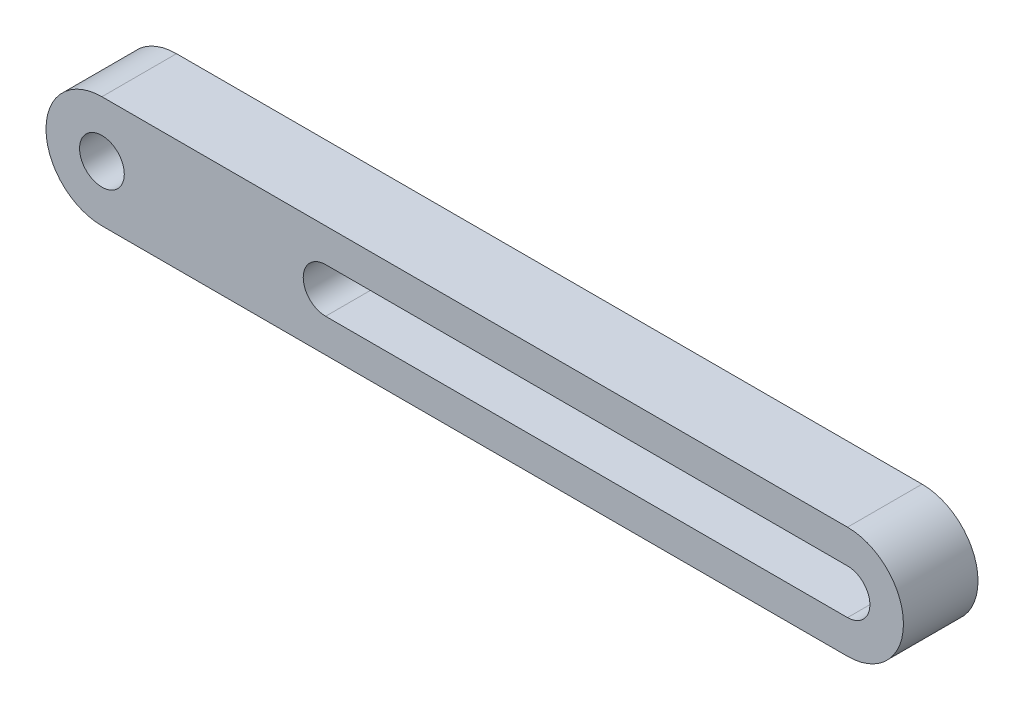
ISO-10303-21;
HEADER;
FILE_DESCRIPTION(('STEP AP214'),'2;1');
FILE_NAME('part.step','',(''),(''),'','','');
FILE_SCHEMA(('AUTOMOTIVE_DESIGN { 1 0 10303 214 1 1 1 1 }'));
ENDSEC;
DATA;
#1=APPLICATION_CONTEXT('core data for automotive mechanical design processes');
#2=APPLICATION_PROTOCOL_DEFINITION('international standard','automotive_design',2000,#1);
#3=PRODUCT_CONTEXT('',#1,'mechanical');
#4=PRODUCT('Part','Part','',(#3));
#5=PRODUCT_RELATED_PRODUCT_CATEGORY('part','',(#4));
#6=PRODUCT_DEFINITION_FORMATION('','',#4);
#7=PRODUCT_DEFINITION_CONTEXT('part definition',#1,'design');
#8=PRODUCT_DEFINITION('design','',#6,#7);
#9=PRODUCT_DEFINITION_SHAPE('','',#8);
#10=(LENGTH_UNIT() NAMED_UNIT(*) SI_UNIT(.MILLI.,.METRE.));
#11=(NAMED_UNIT(*) PLANE_ANGLE_UNIT() SI_UNIT($,.RADIAN.));
#12=(NAMED_UNIT(*) SI_UNIT($,.STERADIAN.) SOLID_ANGLE_UNIT());
#13=UNCERTAINTY_MEASURE_WITH_UNIT(LENGTH_MEASURE(1.E-05),#10,'distance_accuracy_value','');
#14=(GEOMETRIC_REPRESENTATION_CONTEXT(3) GLOBAL_UNCERTAINTY_ASSIGNED_CONTEXT((#13)) GLOBAL_UNIT_ASSIGNED_CONTEXT((#10,
#11,#12)) REPRESENTATION_CONTEXT('',''));
#15=CARTESIAN_POINT('',(0.,0.,0.));
#16=DIRECTION('',(0.,0.,1.));
#17=DIRECTION('',(1.,0.,0.));
#18=AXIS2_PLACEMENT_3D('',#15,#16,#17);
#19=CARTESIAN_POINT('',(0.,0.,5.));
#20=DIRECTION('',(0.,0.,1.));
#21=DIRECTION('',(1.,0.,0.));
#22=AXIS2_PLACEMENT_3D('',#19,#20,#21);
#23=PLANE('',#22);
#24=CARTESIAN_POINT('',(0.,0.,5.));
#25=DIRECTION('',(0.,0.,1.));
#26=DIRECTION('',(1.,0.,0.));
#27=AXIS2_PLACEMENT_3D('',#24,#25,#26);
#28=CIRCLE('',#27,1.5);
#29=CARTESIAN_POINT('',(1.5,0.,5.));
#30=VERTEX_POINT('',#29);
#31=EDGE_CURVE('E134',#30,#30,#28,.T.);
#32=ORIENTED_EDGE('',*,*,#31,.F.);
#33=EDGE_LOOP('',(#32));
#34=FACE_BOUND('',#33,.T.);
#35=CARTESIAN_POINT('',(0.,0.,5.));
#36=DIRECTION('',(0.,0.,1.));
#37=DIRECTION('',(1.,0.,0.));
#38=AXIS2_PLACEMENT_3D('',#35,#36,#37);
#39=CIRCLE('',#38,3.75);
#40=CARTESIAN_POINT('',(0.,3.75,5.));
#41=VERTEX_POINT('',#40);
#42=CARTESIAN_POINT('',(0.,-3.75,5.));
#43=VERTEX_POINT('',#42);
#44=EDGE_CURVE('E140',#41,#43,#39,.T.);
#45=ORIENTED_EDGE('',*,*,#44,.T.);
#46=DIRECTION('',(1.,0.,0.));
#47=VECTOR('',#46,1.);
#48=CARTESIAN_POINT('',(0.,-3.75,5.));
#49=LINE('',#48,#47);
#50=CARTESIAN_POINT('',(50.,-3.75,5.));
#51=VERTEX_POINT('',#50);
#52=EDGE_CURVE('E143',#43,#51,#49,.T.);
#53=ORIENTED_EDGE('',*,*,#52,.T.);
#54=CARTESIAN_POINT('',(50.,0.,5.));
#55=DIRECTION('',(0.,0.,1.));
#56=DIRECTION('',(1.,0.,0.));
#57=AXIS2_PLACEMENT_3D('',#54,#55,#56);
#58=CIRCLE('',#57,3.75);
#59=CARTESIAN_POINT('',(50.,3.75,5.));
#60=VERTEX_POINT('',#59);
#61=EDGE_CURVE('E146',#51,#60,#58,.T.);
#62=ORIENTED_EDGE('',*,*,#61,.T.);
#63=DIRECTION('',(-1.,0.,0.));
#64=VECTOR('',#63,1.);
#65=CARTESIAN_POINT('',(0.,3.75,5.));
#66=LINE('',#65,#64);
#67=EDGE_CURVE('E148',#60,#41,#66,.T.);
#68=ORIENTED_EDGE('',*,*,#67,.T.);
#69=EDGE_LOOP('',(#45,#53,#62,#68));
#70=FACE_BOUND('',#69,.T.);
#71=DIRECTION('',(1.,0.,0.));
#72=VECTOR('',#71,1.);
#73=CARTESIAN_POINT('',(15.,-1.5,5.));
#74=LINE('',#73,#72);
#75=CARTESIAN_POINT('',(15.,-1.5,5.));
#76=VERTEX_POINT('',#75);
#77=CARTESIAN_POINT('',(50.,-1.5,5.));
#78=VERTEX_POINT('',#77);
#79=EDGE_CURVE('E106',#76,#78,#74,.T.);
#80=ORIENTED_EDGE('',*,*,#79,.F.);
#81=CARTESIAN_POINT('',(15.,0.,5.));
#82=DIRECTION('',(0.,0.,1.));
#83=DIRECTION('',(1.,0.,0.));
#84=AXIS2_PLACEMENT_3D('',#81,#82,#83);
#85=CIRCLE('',#84,1.5);
#86=CARTESIAN_POINT('',(15.,1.5,5.));
#87=VERTEX_POINT('',#86);
#88=EDGE_CURVE('E98',#87,#76,#85,.T.);
#89=ORIENTED_EDGE('',*,*,#88,.F.);
#90=DIRECTION('',(-1.,0.,0.));
#91=VECTOR('',#90,1.);
#92=CARTESIAN_POINT('',(15.,1.5,5.));
#93=LINE('',#92,#91);
#94=CARTESIAN_POINT('',(50.,1.5,5.));
#95=VERTEX_POINT('',#94);
#96=EDGE_CURVE('E120',#95,#87,#93,.T.);
#97=ORIENTED_EDGE('',*,*,#96,.F.);
#98=CARTESIAN_POINT('',(50.,0.,5.));
#99=DIRECTION('',(0.,0.,1.));
#100=DIRECTION('',(1.,0.,0.));
#101=AXIS2_PLACEMENT_3D('',#98,#99,#100);
#102=CIRCLE('',#101,1.5);
#103=EDGE_CURVE('E118',#78,#95,#102,.T.);
#104=ORIENTED_EDGE('',*,*,#103,.F.);
#105=EDGE_LOOP('',(#80,#89,#97,#104));
#106=FACE_BOUND('',#105,.T.);
#107=ADVANCED_FACE('F33',(#34,#70,#106),#23,.T.);
#108=CARTESIAN_POINT('',(0.,0.,0.));
#109=DIRECTION('',(0.,0.,1.));
#110=DIRECTION('',(1.,0.,0.));
#111=AXIS2_PLACEMENT_3D('',#108,#109,#110);
#112=PLANE('',#111);
#113=CARTESIAN_POINT('',(0.,0.,0.));
#114=DIRECTION('',(0.,0.,1.));
#115=DIRECTION('',(1.,0.,0.));
#116=AXIS2_PLACEMENT_3D('',#113,#114,#115);
#117=CIRCLE('',#116,1.5);
#118=CARTESIAN_POINT('',(1.5,0.,0.));
#119=VERTEX_POINT('',#118);
#120=EDGE_CURVE('E114',#119,#119,#117,.T.);
#121=ORIENTED_EDGE('',*,*,#120,.T.);
#122=EDGE_LOOP('',(#121));
#123=FACE_BOUND('',#122,.T.);
#124=CARTESIAN_POINT('',(0.,0.,0.));
#125=DIRECTION('',(0.,0.,1.));
#126=DIRECTION('',(1.,0.,0.));
#127=AXIS2_PLACEMENT_3D('',#124,#125,#126);
#128=CIRCLE('',#127,3.75);
#129=CARTESIAN_POINT('',(0.,3.75,0.));
#130=VERTEX_POINT('',#129);
#131=CARTESIAN_POINT('',(0.,-3.75,0.));
#132=VERTEX_POINT('',#131);
#133=EDGE_CURVE('E137',#130,#132,#128,.T.);
#134=ORIENTED_EDGE('',*,*,#133,.F.);
#135=DIRECTION('',(-1.,0.,0.));
#136=VECTOR('',#135,1.);
#137=CARTESIAN_POINT('',(0.,3.75,0.));
#138=LINE('',#137,#136);
#139=CARTESIAN_POINT('',(50.,3.75,0.));
#140=VERTEX_POINT('',#139);
#141=EDGE_CURVE('E144',#140,#130,#138,.T.);
#142=ORIENTED_EDGE('',*,*,#141,.F.);
#143=CARTESIAN_POINT('',(50.,0.,0.));
#144=DIRECTION('',(0.,0.,1.));
#145=DIRECTION('',(1.,0.,0.));
#146=AXIS2_PLACEMENT_3D('',#143,#144,#145);
#147=CIRCLE('',#146,3.75);
#148=CARTESIAN_POINT('',(50.,-3.75,0.));
#149=VERTEX_POINT('',#148);
#150=EDGE_CURVE('E155',#149,#140,#147,.T.);
#151=ORIENTED_EDGE('',*,*,#150,.F.);
#152=DIRECTION('',(1.,0.,0.));
#153=VECTOR('',#152,1.);
#154=CARTESIAN_POINT('',(0.,-3.75,0.));
#155=LINE('',#154,#153);
#156=EDGE_CURVE('E153',#132,#149,#155,.T.);
#157=ORIENTED_EDGE('',*,*,#156,.F.);
#158=EDGE_LOOP('',(#134,#142,#151,#157));
#159=FACE_BOUND('',#158,.T.);
#160=CARTESIAN_POINT('',(15.,0.,0.));
#161=DIRECTION('',(0.,0.,1.));
#162=DIRECTION('',(1.,0.,0.));
#163=AXIS2_PLACEMENT_3D('',#160,#161,#162);
#164=CIRCLE('',#163,1.5);
#165=CARTESIAN_POINT('',(15.,1.5,0.));
#166=VERTEX_POINT('',#165);
#167=CARTESIAN_POINT('',(15.,-1.5,0.));
#168=VERTEX_POINT('',#167);
#169=EDGE_CURVE('E56',#166,#168,#164,.T.);
#170=ORIENTED_EDGE('',*,*,#169,.T.);
#171=DIRECTION('',(1.,0.,0.));
#172=VECTOR('',#171,1.);
#173=CARTESIAN_POINT('',(15.,-1.5,0.));
#174=LINE('',#173,#172);
#175=CARTESIAN_POINT('',(50.,-1.5,0.));
#176=VERTEX_POINT('',#175);
#177=EDGE_CURVE('E113',#168,#176,#174,.T.);
#178=ORIENTED_EDGE('',*,*,#177,.T.);
#179=CARTESIAN_POINT('',(50.,0.,0.));
#180=DIRECTION('',(0.,0.,1.));
#181=DIRECTION('',(1.,0.,0.));
#182=AXIS2_PLACEMENT_3D('',#179,#180,#181);
#183=CIRCLE('',#182,1.5);
#184=CARTESIAN_POINT('',(50.,1.5,0.));
#185=VERTEX_POINT('',#184);
#186=EDGE_CURVE('E126',#176,#185,#183,.T.);
#187=ORIENTED_EDGE('',*,*,#186,.T.);
#188=DIRECTION('',(-1.,0.,0.));
#189=VECTOR('',#188,1.);
#190=CARTESIAN_POINT('',(15.,1.5,0.));
#191=LINE('',#190,#189);
#192=EDGE_CURVE('E107',#185,#166,#191,.T.);
#193=ORIENTED_EDGE('',*,*,#192,.T.);
#194=EDGE_LOOP('',(#170,#178,#187,#193));
#195=FACE_BOUND('',#194,.T.);
#196=ADVANCED_FACE('F173',(#123,#159,#195),#112,.F.);
#197=CARTESIAN_POINT('',(0.,0.,5.));
#198=DIRECTION('',(0.,0.,-1.));
#199=DIRECTION('',(-1.,0.,0.));
#200=AXIS2_PLACEMENT_3D('',#197,#198,#199);
#201=CYLINDRICAL_SURFACE('',#200,3.75);
#202=ORIENTED_EDGE('',*,*,#133,.T.);
#203=DIRECTION('',(0.,0.,-1.));
#204=VECTOR('',#203,1.);
#205=CARTESIAN_POINT('',(0.,-3.75,5.));
#206=LINE('',#205,#204);
#207=EDGE_CURVE('E11',#43,#132,#206,.T.);
#208=ORIENTED_EDGE('',*,*,#207,.F.);
#209=ORIENTED_EDGE('',*,*,#44,.F.);
#210=DIRECTION('',(0.,0.,-1.));
#211=VECTOR('',#210,1.);
#212=CARTESIAN_POINT('',(0.,3.75,5.));
#213=LINE('',#212,#211);
#214=EDGE_CURVE('E150',#41,#130,#213,.T.);
#215=ORIENTED_EDGE('',*,*,#214,.T.);
#216=EDGE_LOOP('',(#202,#208,#209,#215));
#217=FACE_BOUND('',#216,.T.);
#218=ADVANCED_FACE('F35',(#217),#201,.T.);
#219=CARTESIAN_POINT('',(0.,-3.75,5.));
#220=DIRECTION('',(0.,1.,0.));
#221=DIRECTION('',(0.,0.,1.));
#222=AXIS2_PLACEMENT_3D('',#219,#220,#221);
#223=PLANE('',#222);
#224=ORIENTED_EDGE('',*,*,#156,.T.);
#225=DIRECTION('',(0.,0.,-1.));
#226=VECTOR('',#225,1.);
#227=CARTESIAN_POINT('',(50.,-3.75,5.));
#228=LINE('',#227,#226);
#229=EDGE_CURVE('E41',#51,#149,#228,.T.);
#230=ORIENTED_EDGE('',*,*,#229,.F.);
#231=ORIENTED_EDGE('',*,*,#52,.F.);
#232=ORIENTED_EDGE('',*,*,#207,.T.);
#233=EDGE_LOOP('',(#224,#230,#231,#232));
#234=FACE_BOUND('',#233,.T.);
#235=ADVANCED_FACE('F183',(#234),#223,.F.);
#236=CARTESIAN_POINT('',(50.,0.,5.));
#237=DIRECTION('',(0.,0.,-1.));
#238=DIRECTION('',(-1.,0.,0.));
#239=AXIS2_PLACEMENT_3D('',#236,#237,#238);
#240=CYLINDRICAL_SURFACE('',#239,3.75);
#241=ORIENTED_EDGE('',*,*,#150,.T.);
#242=DIRECTION('',(0.,0.,-1.));
#243=VECTOR('',#242,1.);
#244=CARTESIAN_POINT('',(50.,3.75,5.));
#245=LINE('',#244,#243);
#246=EDGE_CURVE('E160',#60,#140,#245,.T.);
#247=ORIENTED_EDGE('',*,*,#246,.F.);
#248=ORIENTED_EDGE('',*,*,#61,.F.);
#249=ORIENTED_EDGE('',*,*,#229,.T.);
#250=EDGE_LOOP('',(#241,#247,#248,#249));
#251=FACE_BOUND('',#250,.T.);
#252=ADVANCED_FACE('F167',(#251),#240,.T.);
#253=CARTESIAN_POINT('',(0.,3.75,5.));
#254=DIRECTION('',(0.,-1.,0.));
#255=DIRECTION('',(0.,0.,-1.));
#256=AXIS2_PLACEMENT_3D('',#253,#254,#255);
#257=PLANE('',#256);
#258=ORIENTED_EDGE('',*,*,#141,.T.);
#259=ORIENTED_EDGE('',*,*,#214,.F.);
#260=ORIENTED_EDGE('',*,*,#67,.F.);
#261=ORIENTED_EDGE('',*,*,#246,.T.);
#262=EDGE_LOOP('',(#258,#259,#260,#261));
#263=FACE_BOUND('',#262,.T.);
#264=ADVANCED_FACE('F177',(#263),#257,.F.);
#265=CARTESIAN_POINT('',(0.,0.,5.));
#266=DIRECTION('',(0.,0.,-1.));
#267=DIRECTION('',(-1.,0.,0.));
#268=AXIS2_PLACEMENT_3D('',#265,#266,#267);
#269=CYLINDRICAL_SURFACE('',#268,1.5);
#270=ORIENTED_EDGE('',*,*,#31,.T.);
#271=EDGE_LOOP('',(#270));
#272=FACE_BOUND('',#271,.T.);
#273=ORIENTED_EDGE('',*,*,#120,.F.);
#274=EDGE_LOOP('',(#273));
#275=FACE_BOUND('',#274,.T.);
#276=ADVANCED_FACE('F200',(#272,#275),#269,.F.);
#277=CARTESIAN_POINT('',(15.,0.,5.));
#278=DIRECTION('',(0.,0.,-1.));
#279=DIRECTION('',(-1.,0.,0.));
#280=AXIS2_PLACEMENT_3D('',#277,#278,#279);
#281=CYLINDRICAL_SURFACE('',#280,1.5);
#282=ORIENTED_EDGE('',*,*,#169,.F.);
#283=DIRECTION('',(0.,0.,-1.));
#284=VECTOR('',#283,1.);
#285=CARTESIAN_POINT('',(15.,1.5,5.));
#286=LINE('',#285,#284);
#287=EDGE_CURVE('E102',#87,#166,#286,.T.);
#288=ORIENTED_EDGE('',*,*,#287,.F.);
#289=ORIENTED_EDGE('',*,*,#88,.T.);
#290=DIRECTION('',(0.,0.,-1.));
#291=VECTOR('',#290,1.);
#292=CARTESIAN_POINT('',(15.,-1.5,5.));
#293=LINE('',#292,#291);
#294=EDGE_CURVE('E101',#76,#168,#293,.T.);
#295=ORIENTED_EDGE('',*,*,#294,.T.);
#296=EDGE_LOOP('',(#282,#288,#289,#295));
#297=FACE_BOUND('',#296,.T.);
#298=ADVANCED_FACE('F100',(#297),#281,.F.);
#299=CARTESIAN_POINT('',(15.,-1.5,5.));
#300=DIRECTION('',(0.,1.,0.));
#301=DIRECTION('',(0.,0.,1.));
#302=AXIS2_PLACEMENT_3D('',#299,#300,#301);
#303=PLANE('',#302);
#304=ORIENTED_EDGE('',*,*,#177,.F.);
#305=ORIENTED_EDGE('',*,*,#294,.F.);
#306=ORIENTED_EDGE('',*,*,#79,.T.);
#307=DIRECTION('',(0.,0.,-1.));
#308=VECTOR('',#307,1.);
#309=CARTESIAN_POINT('',(50.,-1.5,5.));
#310=LINE('',#309,#308);
#311=EDGE_CURVE('E115',#78,#176,#310,.T.);
#312=ORIENTED_EDGE('',*,*,#311,.T.);
#313=EDGE_LOOP('',(#304,#305,#306,#312));
#314=FACE_BOUND('',#313,.T.);
#315=ADVANCED_FACE('F110',(#314),#303,.T.);
#316=CARTESIAN_POINT('',(50.,0.,5.));
#317=DIRECTION('',(0.,0.,-1.));
#318=DIRECTION('',(-1.,0.,0.));
#319=AXIS2_PLACEMENT_3D('',#316,#317,#318);
#320=CYLINDRICAL_SURFACE('',#319,1.5);
#321=ORIENTED_EDGE('',*,*,#186,.F.);
#322=ORIENTED_EDGE('',*,*,#311,.F.);
#323=ORIENTED_EDGE('',*,*,#103,.T.);
#324=DIRECTION('',(0.,0.,-1.));
#325=VECTOR('',#324,1.);
#326=CARTESIAN_POINT('',(50.,1.5,5.));
#327=LINE('',#326,#325);
#328=EDGE_CURVE('E48',#95,#185,#327,.T.);
#329=ORIENTED_EDGE('',*,*,#328,.T.);
#330=EDGE_LOOP('',(#321,#322,#323,#329));
#331=FACE_BOUND('',#330,.T.);
#332=ADVANCED_FACE('F216',(#331),#320,.F.);
#333=CARTESIAN_POINT('',(15.,1.5,5.));
#334=DIRECTION('',(0.,-1.,0.));
#335=DIRECTION('',(0.,0.,-1.));
#336=AXIS2_PLACEMENT_3D('',#333,#334,#335);
#337=PLANE('',#336);
#338=ORIENTED_EDGE('',*,*,#192,.F.);
#339=ORIENTED_EDGE('',*,*,#328,.F.);
#340=ORIENTED_EDGE('',*,*,#96,.T.);
#341=ORIENTED_EDGE('',*,*,#287,.T.);
#342=EDGE_LOOP('',(#338,#339,#340,#341));
#343=FACE_BOUND('',#342,.T.);
#344=ADVANCED_FACE('F221',(#343),#337,.T.);
#345=CLOSED_SHELL('',(#107,#196,#218,#235,#252,#264,#276,#298,#315,#332,#344));
#346=MANIFOLD_SOLID_BREP('B2',#345);
#347=ADVANCED_BREP_SHAPE_REPRESENTATION('',(#18,#346),#14);
#348=SHAPE_DEFINITION_REPRESENTATION(#9,#347);
ENDSEC;
END-ISO-10303-21;
